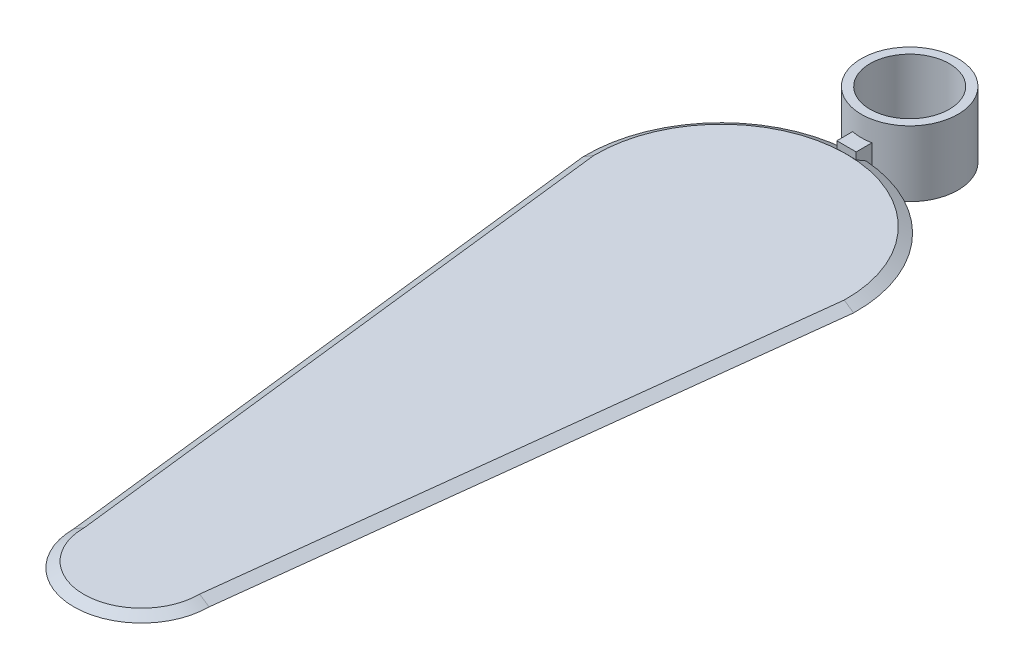
ISO-10303-21;
HEADER;
FILE_DESCRIPTION(('STEP AP214'),'2;1');
FILE_NAME('part.step','',(''),(''),'','','');
FILE_SCHEMA(('AUTOMOTIVE_DESIGN { 1 0 10303 214 1 1 1 1 }'));
ENDSEC;
DATA;
#1=APPLICATION_CONTEXT('core data for automotive mechanical design processes');
#2=APPLICATION_PROTOCOL_DEFINITION('international standard','automotive_design',2000,#1);
#3=PRODUCT_CONTEXT('',#1,'mechanical');
#4=PRODUCT('Part','Part','',(#3));
#5=PRODUCT_RELATED_PRODUCT_CATEGORY('part','',(#4));
#6=PRODUCT_DEFINITION_FORMATION('','',#4);
#7=PRODUCT_DEFINITION_CONTEXT('part definition',#1,'design');
#8=PRODUCT_DEFINITION('design','',#6,#7);
#9=PRODUCT_DEFINITION_SHAPE('','',#8);
#10=(LENGTH_UNIT() NAMED_UNIT(*) SI_UNIT(.MILLI.,.METRE.));
#11=(NAMED_UNIT(*) PLANE_ANGLE_UNIT() SI_UNIT($,.RADIAN.));
#12=(NAMED_UNIT(*) SI_UNIT($,.STERADIAN.) SOLID_ANGLE_UNIT());
#13=UNCERTAINTY_MEASURE_WITH_UNIT(LENGTH_MEASURE(1.E-05),#10,'distance_accuracy_value','');
#14=(GEOMETRIC_REPRESENTATION_CONTEXT(3) GLOBAL_UNCERTAINTY_ASSIGNED_CONTEXT((#13)) GLOBAL_UNIT_ASSIGNED_CONTEXT((#10,
#11,#12)) REPRESENTATION_CONTEXT('',''));
#15=CARTESIAN_POINT('',(0.,0.,0.));
#16=DIRECTION('',(0.,0.,1.));
#17=DIRECTION('',(1.,0.,0.));
#18=AXIS2_PLACEMENT_3D('',#15,#16,#17);
#19=CARTESIAN_POINT('',(0.,0.,-30.));
#20=DIRECTION('',(0.,-1.,0.));
#21=DIRECTION('',(0.,0.,1.));
#22=AXIS2_PLACEMENT_3D('',#19,#20,#21);
#23=CONICAL_SURFACE('',#22,7.,1.0471975511966);
#24=CARTESIAN_POINT('',(-0.5,-0.356011022091875,-37.6002));
#25=CARTESIAN_POINT('',(-0.5,-0.190875454875645,-37.3135814461425));
#26=CARTESIAN_POINT('',(-0.5,-0.025783876376643,-37.0269375661195));
#27=CARTESIAN_POINT('',(-0.5,0.304311304173156,-36.4535991520296));
#28=CARTESIAN_POINT('',(-0.5,0.469314906223426,-36.1669046179624));
#29=CARTESIAN_POINT('',(-0.5,0.634274519555943,-35.8801847577293));
#30=B_SPLINE_CURVE_WITH_KNOTS('',3,(#24,#25,#26,#27,#28,#29),.UNSPECIFIED.,.F.,.F.,(4,2,4),(0.,
0.9923605641163,1.9847211341625),.UNSPECIFIED.);
#31=CARTESIAN_POINT('',(-0.5,0.,-36.9821200218845));
#32=VERTEX_POINT('',#31);
#33=CARTESIAN_POINT('',(-0.5,0.288880028110601,-36.4803847577293));
#34=VERTEX_POINT('',#33);
#35=EDGE_CURVE('E198',#32,#34,#30,.T.);
#36=ORIENTED_EDGE('',*,*,#35,.F.);
#37=CARTESIAN_POINT('',(0.,0.,-30.));
#38=DIRECTION('',(0.,1.,0.));
#39=DIRECTION('',(0.,0.,1.));
#40=AXIS2_PLACEMENT_3D('',#37,#38,#39);
#41=CIRCLE('',#40,7.);
#42=CARTESIAN_POINT('',(-6.99835475642423,0.,-29.8482412993123));
#43=VERTEX_POINT('',#42);
#44=EDGE_CURVE('E209',#32,#43,#41,.T.);
#45=ORIENTED_EDGE('',*,*,#44,.T.);
#46=CARTESIAN_POINT('',(-6.4793415271409,0.3,-29.8837245387963));
#47=CARTESIAN_POINT('',(-6.5658502338458,0.250001697850549,-29.8778914022074));
#48=CARTESIAN_POINT('',(-6.65235568991159,0.200002546617972,-29.8720178972704));
#49=CARTESIAN_POINT('',(-6.82536009967262,0.100002546617951,-29.8601901507747));
#50=CARTESIAN_POINT('',(-6.91185905336794,0.0500016978505284,-29.8542359092171));
#51=CARTESIAN_POINT('',(-6.99835475642423,0.,-29.8482412993124));
#52=B_SPLINE_CURVE_WITH_KNOTS('',3,(#46,#47,#48,#49,#50,#51),.UNSPECIFIED.,.F.,.F.,(4,2,4),(0.,
0.300263990548924,0.600527977306189),.UNSPECIFIED.);
#53=CARTESIAN_POINT('',(-6.4793415271409,0.3,-29.8837245387963));
#54=VERTEX_POINT('',#53);
#55=EDGE_CURVE('E249',#54,#43,#52,.T.);
#56=ORIENTED_EDGE('',*,*,#55,.F.);
#57=CARTESIAN_POINT('',(0.,0.3,-30.));
#58=DIRECTION('',(0.,1.,0.));
#59=DIRECTION('',(0.,0.,1.));
#60=AXIS2_PLACEMENT_3D('',#57,#58,#59);
#61=CIRCLE('',#60,6.48038475772933);
#62=CARTESIAN_POINT('',(0.,0.3,-36.4803847577293));
#63=VERTEX_POINT('',#62);
#64=EDGE_CURVE('E257',#63,#54,#61,.T.);
#65=ORIENTED_EDGE('',*,*,#64,.F.);
#66=CARTESIAN_POINT('',(1.54423065089106,0.195240115527585,-36.4803847577293));
#67=CARTESIAN_POINT('',(1.41601210598089,0.21240874185737,-36.4803847577293));
#68=CARTESIAN_POINT('',(1.28751957013304,0.227574355854738,-36.4803847577293));
#69=CARTESIAN_POINT('',(1.03010013279206,0.25373073161394,-36.4803847577293));
#70=CARTESIAN_POINT('',(0.901173195445944,0.264721139818665,-36.4803847577293));
#71=CARTESIAN_POINT('',(0.643610690981503,0.282314984395471,-36.4803847577293));
#72=CARTESIAN_POINT('',(0.514976488281941,0.288938255896818,-36.4803847577293));
#73=CARTESIAN_POINT('',(0.257561519603568,0.297780674097169,-36.4803847577293));
#74=CARTESIAN_POINT('',(0.128780759801784,0.299999999999999,-36.4803847577293));
#75=CARTESIAN_POINT('',(-0.128780759801784,0.299999999999999,-36.4803847577293));
#76=CARTESIAN_POINT('',(-0.257561519603568,0.297780674097169,-36.4803847577293));
#77=CARTESIAN_POINT('',(-0.514976488281941,0.288938255896818,-36.4803847577293));
#78=CARTESIAN_POINT('',(-0.643610690981503,0.282314984395472,-36.4803847577293));
#79=CARTESIAN_POINT('',(-0.901173195445945,0.264721139818665,-36.4803847577293));
#80=CARTESIAN_POINT('',(-1.03010013279206,0.25373073161394,-36.4803847577293));
#81=CARTESIAN_POINT('',(-1.28751957013304,0.227574355854738,-36.4803847577293));
#82=CARTESIAN_POINT('',(-1.41601210598089,0.21240874185737,-36.4803847577293));
#83=CARTESIAN_POINT('',(-1.54423065089106,0.195240115527585,-36.4803847577293));
#84=B_SPLINE_CURVE_WITH_KNOTS('',3,(#66,#67,#68,#69,#70,#71,#72,#73,#74,#75,#76,#77,#78,#79,#80,
#81,#82,#83),.UNSPECIFIED.,.F.,.F.,(4,2,2,2,2,2,2,2,4),(0.,0.388081475168734,0.776195805818958,
1.16253498702555,1.54885844713,1.93518190723445,2.32152108844104,2.70963541909126,
3.09771689426),.UNSPECIFIED.);
#85=EDGE_CURVE('E154',#63,#34,#84,.T.);
#86=ORIENTED_EDGE('',*,*,#85,.T.);
#87=EDGE_LOOP('',(#36,#45,#56,#65,#86));
#88=FACE_BOUND('',#87,.T.);
#89=ADVANCED_FACE('F43',(#88),#23,.T.);
#90=CARTESIAN_POINT('',(0.5,0.634274519555942,-35.8801847577293));
#91=CARTESIAN_POINT('',(0.5,0.469314906223425,-36.1669046179624));
#92=CARTESIAN_POINT('',(0.5,0.304311304173155,-36.4535991520296));
#93=CARTESIAN_POINT('',(0.5,-0.025783876376643,-37.0269375661195));
#94=CARTESIAN_POINT('',(0.5,-0.190875454875645,-37.3135814461425));
#95=CARTESIAN_POINT('',(0.5,-0.356011022091875,-37.6002));
#96=B_SPLINE_CURVE_WITH_KNOTS('',3,(#90,#91,#92,#93,#94,#95),.UNSPECIFIED.,.F.,.F.,(4,2,4),(0.,
0.992360570046198,1.9847211341625),.UNSPECIFIED.);
#97=CARTESIAN_POINT('',(0.5,0.288880028110601,-36.4803847577293));
#98=VERTEX_POINT('',#97);
#99=CARTESIAN_POINT('',(0.5,0.,-36.9821200218845));
#100=VERTEX_POINT('',#99);
#101=EDGE_CURVE('E168',#98,#100,#96,.T.);
#102=ORIENTED_EDGE('',*,*,#101,.F.);
#103=EDGE_CURVE('E167',#98,#63,#84,.T.);
#104=ORIENTED_EDGE('',*,*,#103,.T.);
#105=CARTESIAN_POINT('',(6.4793415271409,0.3,-29.8837245387963));
#106=VERTEX_POINT('',#105);
#107=EDGE_CURVE('E258',#106,#63,#61,.T.);
#108=ORIENTED_EDGE('',*,*,#107,.F.);
#109=CARTESIAN_POINT('',(6.4793415271409,0.3,-29.8837245387963));
#110=CARTESIAN_POINT('',(6.5658502338458,0.250001697850549,-29.8778914022074));
#111=CARTESIAN_POINT('',(6.65235568991159,0.200002546617972,-29.8720178972704));
#112=CARTESIAN_POINT('',(6.82536009967262,0.100002546617951,-29.8601901507747));
#113=CARTESIAN_POINT('',(6.91185905336794,0.0500016978505284,-29.8542359092171));
#114=CARTESIAN_POINT('',(6.99835475642423,0.,-29.8482412993124));
#115=B_SPLINE_CURVE_WITH_KNOTS('',3,(#109,#110,#111,#112,#113,#114),.UNSPECIFIED.,.F.,.F.,(4,2,
4),(0.,0.300263990548924,0.600527977306189),.UNSPECIFIED.);
#116=CARTESIAN_POINT('',(6.99835475642423,0.,-29.8482412993123));
#117=VERTEX_POINT('',#116);
#118=EDGE_CURVE('E226',#106,#117,#115,.T.);
#119=ORIENTED_EDGE('',*,*,#118,.T.);
#120=EDGE_CURVE('E210',#117,#100,#41,.T.);
#121=ORIENTED_EDGE('',*,*,#120,.T.);
#122=EDGE_LOOP('',(#102,#104,#108,#119,#121));
#123=FACE_BOUND('',#122,.T.);
#124=ADVANCED_FACE('F324',(#123),#23,.T.);
#125=CARTESIAN_POINT('',(0.,0.,0.));
#126=DIRECTION('',(0.,1.,0.));
#127=DIRECTION('',(0.,0.,1.));
#128=AXIS2_PLACEMENT_3D('',#125,#126,#127);
#129=PLANE('',#128);
#130=DIRECTION('',(0.,0.,-1.));
#131=VECTOR('',#130,1.);
#132=CARTESIAN_POINT('',(-0.5,0.,0.));
#133=LINE('',#132,#131);
#134=CARTESIAN_POINT('',(-0.5,0.,-36.4803847577293));
#135=VERTEX_POINT('',#134);
#136=EDGE_CURVE('E11',#135,#32,#133,.T.);
#137=ORIENTED_EDGE('',*,*,#136,.F.);
#138=DIRECTION('',(1.,0.,0.));
#139=VECTOR('',#138,1.);
#140=CARTESIAN_POINT('',(0.,0.,-36.4803847577293));
#141=LINE('',#140,#139);
#142=CARTESIAN_POINT('',(0.5,0.,-36.4803847577293));
#143=VERTEX_POINT('',#142);
#144=EDGE_CURVE('E225',#135,#143,#141,.T.);
#145=ORIENTED_EDGE('',*,*,#144,.T.);
#146=DIRECTION('',(0.,0.,1.));
#147=VECTOR('',#146,1.);
#148=CARTESIAN_POINT('',(0.5,0.,0.));
#149=LINE('',#148,#147);
#150=EDGE_CURVE('E51',#100,#143,#149,.T.);
#151=ORIENTED_EDGE('',*,*,#150,.F.);
#152=ORIENTED_EDGE('',*,*,#120,.F.);
#153=DIRECTION('',(0.116407902319493,0.,-0.993201490271523));
#154=VECTOR('',#153,1.);
#155=CARTESIAN_POINT('',(3.5,0.,0.));
#156=LINE('',#155,#154);
#157=CARTESIAN_POINT('',(3.5,0.,0.));
#158=VERTEX_POINT('',#157);
#159=EDGE_CURVE('E207',#158,#117,#156,.T.);
#160=ORIENTED_EDGE('',*,*,#159,.F.);
#161=CARTESIAN_POINT('',(0.,0.,0.));
#162=DIRECTION('',(0.,1.,0.));
#163=DIRECTION('',(0.,0.,1.));
#164=AXIS2_PLACEMENT_3D('',#161,#162,#163);
#165=CIRCLE('',#164,3.5);
#166=CARTESIAN_POINT('',(-3.5,0.,0.));
#167=VERTEX_POINT('',#166);
#168=EDGE_CURVE('E204',#167,#158,#165,.T.);
#169=ORIENTED_EDGE('',*,*,#168,.F.);
#170=DIRECTION('',(0.116407902319493,0.,0.993201490271523));
#171=VECTOR('',#170,1.);
#172=CARTESIAN_POINT('',(-3.5,0.,0.));
#173=LINE('',#172,#171);
#174=EDGE_CURVE('E213',#43,#167,#173,.T.);
#175=ORIENTED_EDGE('',*,*,#174,.F.);
#176=ORIENTED_EDGE('',*,*,#44,.F.);
#177=EDGE_LOOP('',(#137,#145,#151,#152,#160,#169,#175,#176));
#178=FACE_BOUND('',#177,.T.);
#179=ADVANCED_FACE('F268',(#178),#129,.F.);
#180=CARTESIAN_POINT('',(0.,0.,0.));
#181=DIRECTION('',(0.,-1.,0.));
#182=DIRECTION('',(0.,0.,1.));
#183=AXIS2_PLACEMENT_3D('',#180,#181,#182);
#184=CONICAL_SURFACE('',#183,3.5,1.0471975511966);
#185=ORIENTED_EDGE('',*,*,#168,.T.);
#186=CARTESIAN_POINT('',(2.98024237765955,0.3,-0.0291320186565786));
#187=CARTESIAN_POINT('',(3.06688369684214,0.250005557023996,-0.0244877635112759));
#188=CARTESIAN_POINT('',(3.1535174955103,0.200008333294831,-0.0197379674906328));
#189=CARTESIAN_POINT('',(3.32677003628788,0.100008333293885,-0.0100272945691021));
#190=CARTESIAN_POINT('',(3.4133887784,0.0500055570231003,-0.00506641770605606));
#191=CARTESIAN_POINT('',(3.50000000000038,1.51198937883978E-13,-5.51110037721241E-12));
#192=B_SPLINE_CURVE_WITH_KNOTS('',3,(#186,#187,#188,#189,#190,#191),.UNSPECIFIED.,.F.,.F.,(4,2,
4),(0.,0.300415182923278,0.600830311989886),.UNSPECIFIED.);
#193=CARTESIAN_POINT('',(2.98024237765955,0.3,-0.0291320186565786));
#194=VERTEX_POINT('',#193);
#195=EDGE_CURVE('E216',#194,#158,#192,.T.);
#196=ORIENTED_EDGE('',*,*,#195,.F.);
#197=CARTESIAN_POINT('',(0.,0.3,0.));
#198=DIRECTION('',(0.,1.,0.));
#199=DIRECTION('',(0.,0.,1.));
#200=AXIS2_PLACEMENT_3D('',#197,#198,#199);
#201=CIRCLE('',#200,2.98038475772933);
#202=CARTESIAN_POINT('',(-2.98024237765955,0.3,-0.0291320186565786));
#203=VERTEX_POINT('',#202);
#204=EDGE_CURVE('E215',#203,#194,#201,.T.);
#205=ORIENTED_EDGE('',*,*,#204,.F.);
#206=CARTESIAN_POINT('',(-2.98024237765955,0.3,-0.0291320186565786));
#207=CARTESIAN_POINT('',(-3.06688369684214,0.250005557023996,-0.0244877635112759));
#208=CARTESIAN_POINT('',(-3.1535174955103,0.200008333294831,-0.0197379674906328));
#209=CARTESIAN_POINT('',(-3.32677003628788,0.100008333293885,-0.0100272945691021));
#210=CARTESIAN_POINT('',(-3.4133887784,0.0500055570231003,-0.00506641770605606));
#211=CARTESIAN_POINT('',(-3.50000000000038,1.51198937883978E-13,-5.51110037721241E-12));
#212=B_SPLINE_CURVE_WITH_KNOTS('',3,(#206,#207,#208,#209,#210,#211),.UNSPECIFIED.,.F.,.F.,(4,2,
4),(0.,0.300415182923278,0.600830311989886),.UNSPECIFIED.);
#213=EDGE_CURVE('E227',#203,#167,#212,.T.);
#214=ORIENTED_EDGE('',*,*,#213,.T.);
#215=EDGE_LOOP('',(#185,#196,#205,#214));
#216=FACE_BOUND('',#215,.T.);
#217=ADVANCED_FACE('F233',(#216),#184,.T.);
#218=CARTESIAN_POINT('',(3.5,0.,0.));
#219=DIRECTION('',(0.49660074513576,0.86602540378444,0.0582039511597464));
#220=DIRECTION('',(-0.867496058544027,0.497444055558591,0.));
#221=AXIS2_PLACEMENT_3D('',#218,#219,#220);
#222=PLANE('',#221);
#223=ORIENTED_EDGE('',*,*,#159,.T.);
#224=ORIENTED_EDGE('',*,*,#118,.F.);
#225=DIRECTION('',(-0.116407902319493,0.,0.993201490271524));
#226=VECTOR('',#225,1.);
#227=CARTESIAN_POINT('',(2.98391736700898,0.3,-0.0604873203659635));
#228=LINE('',#227,#226);
#229=EDGE_CURVE('E255',#194,#106,#228,.F.);
#230=ORIENTED_EDGE('',*,*,#229,.F.);
#231=ORIENTED_EDGE('',*,*,#195,.T.);
#232=EDGE_LOOP('',(#223,#224,#230,#231));
#233=FACE_BOUND('',#232,.T.);
#234=ADVANCED_FACE('F235',(#233),#222,.T.);
#235=CARTESIAN_POINT('',(-3.5,0.,0.));
#236=DIRECTION('',(-0.49660074513576,0.86602540378444,0.0582039511597464));
#237=DIRECTION('',(-0.867496058544027,-0.497444055558591,0.));
#238=AXIS2_PLACEMENT_3D('',#235,#236,#237);
#239=PLANE('',#238);
#240=ORIENTED_EDGE('',*,*,#174,.T.);
#241=ORIENTED_EDGE('',*,*,#213,.F.);
#242=DIRECTION('',(-0.116407902319493,0.,-0.993201490271524));
#243=VECTOR('',#242,1.);
#244=CARTESIAN_POINT('',(-2.98391736700898,0.3,-0.0604873203659635));
#245=LINE('',#244,#243);
#246=EDGE_CURVE('E66',#54,#203,#245,.F.);
#247=ORIENTED_EDGE('',*,*,#246,.F.);
#248=ORIENTED_EDGE('',*,*,#55,.T.);
#249=EDGE_LOOP('',(#240,#241,#247,#248));
#250=FACE_BOUND('',#249,.T.);
#251=ADVANCED_FACE('F238',(#250),#239,.T.);
#252=CARTESIAN_POINT('',(0.,0.3,0.));
#253=DIRECTION('',(0.,1.,0.));
#254=DIRECTION('',(0.,0.,1.));
#255=AXIS2_PLACEMENT_3D('',#252,#253,#254);
#256=PLANE('',#255);
#257=ORIENTED_EDGE('',*,*,#204,.T.);
#258=ORIENTED_EDGE('',*,*,#229,.T.);
#259=ORIENTED_EDGE('',*,*,#107,.T.);
#260=ORIENTED_EDGE('',*,*,#64,.T.);
#261=ORIENTED_EDGE('',*,*,#246,.T.);
#262=EDGE_LOOP('',(#257,#258,#259,#260,#261));
#263=FACE_BOUND('',#262,.T.);
#264=ADVANCED_FACE('F195',(#263),#256,.T.);
#265=CARTESIAN_POINT('',(-0.5,0.65,-36.4803847577293));
#266=DIRECTION('',(1.,0.,0.));
#267=DIRECTION('',(0.,1.,0.));
#268=AXIS2_PLACEMENT_3D('',#265,#266,#267);
#269=PLANE('',#268);
#270=ORIENTED_EDGE('',*,*,#136,.T.);
#271=ORIENTED_EDGE('',*,*,#35,.T.);
#272=DIRECTION('',(0.,-1.,0.));
#273=VECTOR('',#272,1.);
#274=CARTESIAN_POINT('',(-0.5,0.65,-36.4803847577293));
#275=LINE('',#274,#273);
#276=CARTESIAN_POINT('',(-0.5,0.65,-36.4803847577293));
#277=VERTEX_POINT('',#276);
#278=EDGE_CURVE('E273',#277,#34,#275,.T.);
#279=ORIENTED_EDGE('',*,*,#278,.F.);
#280=DIRECTION('',(0.,0.,-1.));
#281=VECTOR('',#280,1.);
#282=CARTESIAN_POINT('',(-0.5,0.65,-36.4803847577293));
#283=LINE('',#282,#281);
#284=CARTESIAN_POINT('',(-0.5,0.65,-37.3));
#285=VERTEX_POINT('',#284);
#286=EDGE_CURVE('E156',#277,#285,#283,.T.);
#287=ORIENTED_EDGE('',*,*,#286,.T.);
#288=DIRECTION('',(0.,-1.,0.));
#289=VECTOR('',#288,1.);
#290=CARTESIAN_POINT('',(-0.5,-0.35,-37.3));
#291=LINE('',#290,#289);
#292=CARTESIAN_POINT('',(-0.499999999999995,-0.35,-37.3));
#293=VERTEX_POINT('',#292);
#294=EDGE_CURVE('E139',#285,#293,#291,.T.);
#295=ORIENTED_EDGE('',*,*,#294,.T.);
#296=DIRECTION('',(0.,0.,-1.));
#297=VECTOR('',#296,1.);
#298=CARTESIAN_POINT('',(-0.5,-0.35,-36.4803847577293));
#299=LINE('',#298,#297);
#300=CARTESIAN_POINT('',(-0.5,-0.35,-36.4803847577293));
#301=VERTEX_POINT('',#300);
#302=EDGE_CURVE('E147',#301,#293,#299,.T.);
#303=ORIENTED_EDGE('',*,*,#302,.F.);
#304=EDGE_CURVE('E271',#135,#301,#275,.T.);
#305=ORIENTED_EDGE('',*,*,#304,.F.);
#306=EDGE_LOOP('',(#270,#271,#279,#287,#295,#303,#305));
#307=FACE_BOUND('',#306,.T.);
#308=ADVANCED_FACE('F189',(#307),#269,.F.);
#309=CARTESIAN_POINT('',(0.5,0.65,-36.4803847577293));
#310=DIRECTION('',(-1.,0.,0.));
#311=DIRECTION('',(0.,0.,1.));
#312=AXIS2_PLACEMENT_3D('',#309,#310,#311);
#313=PLANE('',#312);
#314=DIRECTION('',(0.,1.,0.));
#315=VECTOR('',#314,1.);
#316=CARTESIAN_POINT('',(0.5,0.65,-36.4803847577293));
#317=LINE('',#316,#315);
#318=CARTESIAN_POINT('',(0.5,0.65,-36.4803847577293));
#319=VERTEX_POINT('',#318);
#320=EDGE_CURVE('E280',#98,#319,#317,.T.);
#321=ORIENTED_EDGE('',*,*,#320,.F.);
#322=ORIENTED_EDGE('',*,*,#101,.T.);
#323=ORIENTED_EDGE('',*,*,#150,.T.);
#324=CARTESIAN_POINT('',(0.5,-0.35,-36.4803847577293));
#325=VERTEX_POINT('',#324);
#326=EDGE_CURVE('E58',#325,#143,#317,.T.);
#327=ORIENTED_EDGE('',*,*,#326,.F.);
#328=DIRECTION('',(0.,0.,-1.));
#329=VECTOR('',#328,1.);
#330=CARTESIAN_POINT('',(0.5,-0.35,-36.4803847577293));
#331=LINE('',#330,#329);
#332=CARTESIAN_POINT('',(0.499999999999992,-0.35,-37.3));
#333=VERTEX_POINT('',#332);
#334=EDGE_CURVE('E145',#325,#333,#331,.T.);
#335=ORIENTED_EDGE('',*,*,#334,.T.);
#336=DIRECTION('',(0.,1.,0.));
#337=VECTOR('',#336,1.);
#338=CARTESIAN_POINT('',(0.5,-0.35,-37.3));
#339=LINE('',#338,#337);
#340=CARTESIAN_POINT('',(0.5,0.65,-37.3));
#341=VERTEX_POINT('',#340);
#342=EDGE_CURVE('E128',#333,#341,#339,.T.);
#343=ORIENTED_EDGE('',*,*,#342,.T.);
#344=DIRECTION('',(0.,0.,-1.));
#345=VECTOR('',#344,1.);
#346=CARTESIAN_POINT('',(0.5,0.65,-36.4803847577293));
#347=LINE('',#346,#345);
#348=EDGE_CURVE('E152',#319,#341,#347,.T.);
#349=ORIENTED_EDGE('',*,*,#348,.F.);
#350=EDGE_LOOP('',(#321,#322,#323,#327,#335,#343,#349));
#351=FACE_BOUND('',#350,.T.);
#352=ADVANCED_FACE('F151',(#351),#313,.F.);
#353=CARTESIAN_POINT('',(0.,0.,-36.4803847577293));
#354=DIRECTION('',(0.,0.,1.));
#355=DIRECTION('',(1.,0.,0.));
#356=AXIS2_PLACEMENT_3D('',#353,#354,#355);
#357=PLANE('',#356);
#358=ORIENTED_EDGE('',*,*,#103,.F.);
#359=ORIENTED_EDGE('',*,*,#320,.T.);
#360=DIRECTION('',(-1.,0.,0.));
#361=VECTOR('',#360,1.);
#362=CARTESIAN_POINT('',(-0.5,0.65,-36.4803847577293));
#363=LINE('',#362,#361);
#364=EDGE_CURVE('E282',#319,#277,#363,.T.);
#365=ORIENTED_EDGE('',*,*,#364,.T.);
#366=ORIENTED_EDGE('',*,*,#278,.T.);
#367=ORIENTED_EDGE('',*,*,#85,.F.);
#368=EDGE_LOOP('',(#358,#359,#365,#366,#367));
#369=FACE_BOUND('',#368,.T.);
#370=ADVANCED_FACE('F175',(#369),#357,.T.);
#371=ORIENTED_EDGE('',*,*,#144,.F.);
#372=ORIENTED_EDGE('',*,*,#304,.T.);
#373=DIRECTION('',(1.,0.,0.));
#374=VECTOR('',#373,1.);
#375=CARTESIAN_POINT('',(-0.5,-0.35,-36.4803847577293));
#376=LINE('',#375,#374);
#377=EDGE_CURVE('E276',#301,#325,#376,.T.);
#378=ORIENTED_EDGE('',*,*,#377,.T.);
#379=ORIENTED_EDGE('',*,*,#326,.T.);
#380=EDGE_LOOP('',(#371,#372,#378,#379));
#381=FACE_BOUND('',#380,.T.);
#382=ADVANCED_FACE('F180',(#381),#357,.T.);
#383=CARTESIAN_POINT('',(-0.5,-0.35,-36.4803847577293));
#384=DIRECTION('',(0.,1.,0.));
#385=DIRECTION('',(0.,0.,1.));
#386=AXIS2_PLACEMENT_3D('',#383,#384,#385);
#387=PLANE('',#386);
#388=ORIENTED_EDGE('',*,*,#302,.T.);
#389=CARTESIAN_POINT('',(0.,-0.35,-39.7494897427832));
#390=DIRECTION('',(0.,1.,0.));
#391=DIRECTION('',(0.,0.,1.));
#392=AXIS2_PLACEMENT_3D('',#389,#390,#391);
#393=CIRCLE('',#392,2.5);
#394=EDGE_CURVE('E131',#293,#333,#393,.T.);
#395=ORIENTED_EDGE('',*,*,#394,.T.);
#396=ORIENTED_EDGE('',*,*,#334,.F.);
#397=ORIENTED_EDGE('',*,*,#377,.F.);
#398=EDGE_LOOP('',(#388,#395,#396,#397));
#399=FACE_BOUND('',#398,.T.);
#400=ADVANCED_FACE('F143',(#399),#387,.F.);
#401=CARTESIAN_POINT('',(-0.5,0.65,-36.4803847577293));
#402=DIRECTION('',(0.,-1.,0.));
#403=DIRECTION('',(0.,0.,-1.));
#404=AXIS2_PLACEMENT_3D('',#401,#402,#403);
#405=PLANE('',#404);
#406=ORIENTED_EDGE('',*,*,#348,.T.);
#407=CARTESIAN_POINT('',(0.,0.65,-39.7494897427832));
#408=DIRECTION('',(0.,-1.,0.));
#409=DIRECTION('',(0.,0.,-1.));
#410=AXIS2_PLACEMENT_3D('',#407,#408,#409);
#411=CIRCLE('',#410,2.5);
#412=EDGE_CURVE('E134',#341,#285,#411,.T.);
#413=ORIENTED_EDGE('',*,*,#412,.T.);
#414=ORIENTED_EDGE('',*,*,#286,.F.);
#415=ORIENTED_EDGE('',*,*,#364,.F.);
#416=EDGE_LOOP('',(#406,#413,#414,#415));
#417=FACE_BOUND('',#416,.T.);
#418=ADVANCED_FACE('F183',(#417),#405,.F.);
#419=CARTESIAN_POINT('',(0.,-1.7,-39.7494897427832));
#420=DIRECTION('',(0.,1.,0.));
#421=DIRECTION('',(0.,0.,1.));
#422=AXIS2_PLACEMENT_3D('',#419,#420,#421);
#423=CYLINDRICAL_SURFACE('',#422,2.5);
#424=CARTESIAN_POINT('',(0.,1.7,-39.7494897427832));
#425=DIRECTION('',(0.,1.,0.));
#426=DIRECTION('',(0.,0.,1.));
#427=AXIS2_PLACEMENT_3D('',#424,#425,#426);
#428=CIRCLE('',#427,2.5);
#429=CARTESIAN_POINT('',(0.,1.7,-37.2494897427832));
#430=VERTEX_POINT('',#429);
#431=EDGE_CURVE('E290',#430,#430,#428,.T.);
#432=ORIENTED_EDGE('',*,*,#431,.F.);
#433=EDGE_LOOP('',(#432));
#434=FACE_BOUND('',#433,.T.);
#435=CARTESIAN_POINT('',(0.,-1.7,-39.7494897427832));
#436=DIRECTION('',(0.,1.,0.));
#437=DIRECTION('',(0.,0.,1.));
#438=AXIS2_PLACEMENT_3D('',#435,#436,#437);
#439=CIRCLE('',#438,2.5);
#440=CARTESIAN_POINT('',(0.,-1.7,-37.2494897427832));
#441=VERTEX_POINT('',#440);
#442=EDGE_CURVE('E287',#441,#441,#439,.T.);
#443=ORIENTED_EDGE('',*,*,#442,.T.);
#444=EDGE_LOOP('',(#443));
#445=FACE_BOUND('',#444,.T.);
#446=ORIENTED_EDGE('',*,*,#294,.F.);
#447=ORIENTED_EDGE('',*,*,#412,.F.);
#448=ORIENTED_EDGE('',*,*,#342,.F.);
#449=ORIENTED_EDGE('',*,*,#394,.F.);
#450=EDGE_LOOP('',(#446,#447,#448,#449));
#451=FACE_BOUND('',#450,.T.);
#452=ADVANCED_FACE('F130',(#434,#445,#451),#423,.T.);
#453=CARTESIAN_POINT('',(0.,-1.7,-39.7494897427832));
#454=DIRECTION('',(0.,1.,0.));
#455=DIRECTION('',(0.,0.,1.));
#456=AXIS2_PLACEMENT_3D('',#453,#454,#455);
#457=PLANE('',#456);
#458=CARTESIAN_POINT('',(0.,-1.7,-39.7494897427832));
#459=DIRECTION('',(0.,1.,0.));
#460=DIRECTION('',(0.,0.,1.));
#461=AXIS2_PLACEMENT_3D('',#458,#459,#460);
#462=CIRCLE('',#461,2.05);
#463=CARTESIAN_POINT('',(0.,-1.7,-37.6994897427832));
#464=VERTEX_POINT('',#463);
#465=EDGE_CURVE('E295',#464,#464,#462,.T.);
#466=ORIENTED_EDGE('',*,*,#465,.T.);
#467=EDGE_LOOP('',(#466));
#468=FACE_BOUND('',#467,.T.);
#469=ORIENTED_EDGE('',*,*,#442,.F.);
#470=EDGE_LOOP('',(#469));
#471=FACE_BOUND('',#470,.T.);
#472=ADVANCED_FACE('F302',(#468,#471),#457,.F.);
#473=CARTESIAN_POINT('',(0.,1.7,-39.7494897427832));
#474=DIRECTION('',(0.,1.,0.));
#475=DIRECTION('',(0.,0.,1.));
#476=AXIS2_PLACEMENT_3D('',#473,#474,#475);
#477=PLANE('',#476);
#478=CARTESIAN_POINT('',(0.,1.7,-39.7494897427832));
#479=DIRECTION('',(0.,1.,0.));
#480=DIRECTION('',(0.,0.,1.));
#481=AXIS2_PLACEMENT_3D('',#478,#479,#480);
#482=CIRCLE('',#481,2.05);
#483=CARTESIAN_POINT('',(0.,1.7,-37.6994897427832));
#484=VERTEX_POINT('',#483);
#485=EDGE_CURVE('E296',#484,#484,#482,.T.);
#486=ORIENTED_EDGE('',*,*,#485,.F.);
#487=EDGE_LOOP('',(#486));
#488=FACE_BOUND('',#487,.T.);
#489=ORIENTED_EDGE('',*,*,#431,.T.);
#490=EDGE_LOOP('',(#489));
#491=FACE_BOUND('',#490,.T.);
#492=ADVANCED_FACE('F308',(#488,#491),#477,.T.);
#493=CARTESIAN_POINT('',(0.,-1.7,-39.7494897427832));
#494=DIRECTION('',(0.,1.,0.));
#495=DIRECTION('',(0.,0.,1.));
#496=AXIS2_PLACEMENT_3D('',#493,#494,#495);
#497=CYLINDRICAL_SURFACE('',#496,2.05);
#498=ORIENTED_EDGE('',*,*,#465,.F.);
#499=EDGE_LOOP('',(#498));
#500=FACE_BOUND('',#499,.T.);
#501=ORIENTED_EDGE('',*,*,#485,.T.);
#502=EDGE_LOOP('',(#501));
#503=FACE_BOUND('',#502,.T.);
#504=ADVANCED_FACE('F305',(#500,#503),#497,.F.);
#505=CLOSED_SHELL('',(#89,#124,#179,#217,#234,#251,#264,#308,#352,#370,#382,#400,#418,#452,#472,
#492,#504));
#506=MANIFOLD_SOLID_BREP('B2',#505);
#507=ADVANCED_BREP_SHAPE_REPRESENTATION('',(#18,#506),#14);
#508=SHAPE_DEFINITION_REPRESENTATION(#9,#507);
ENDSEC;
END-ISO-10303-21;
